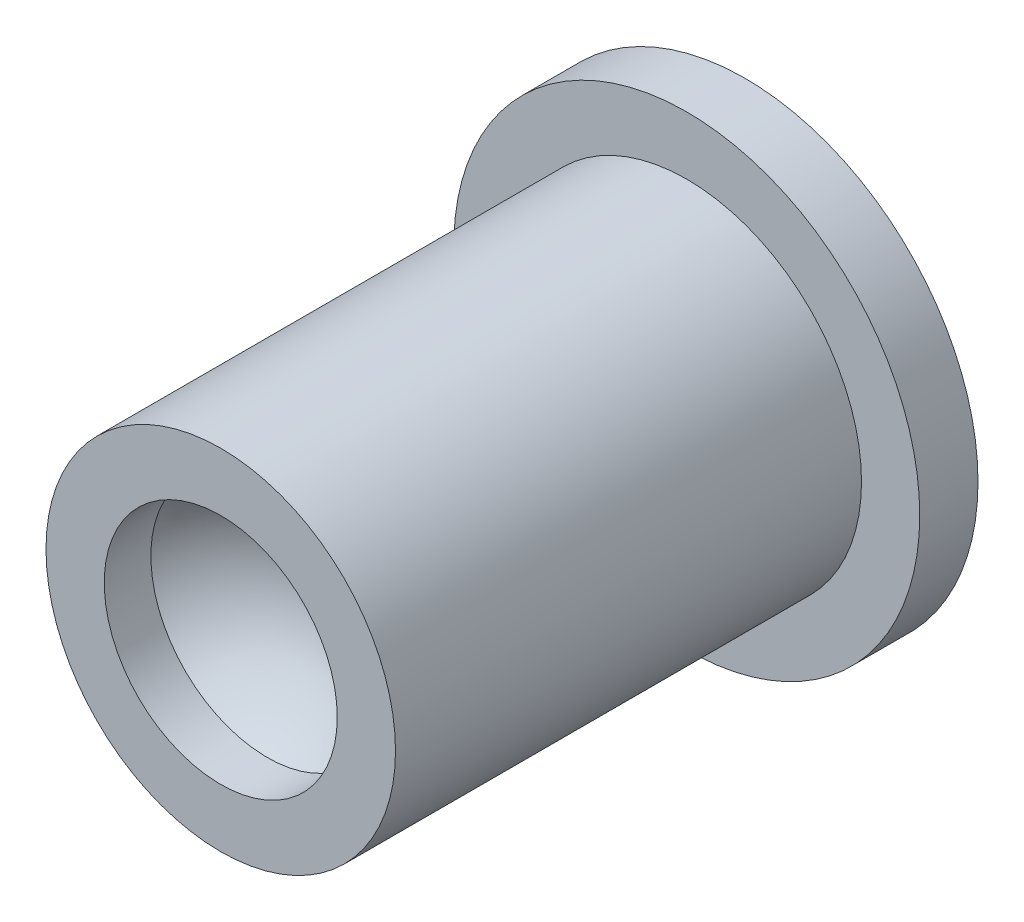
ISO-10303-21;
HEADER;
FILE_DESCRIPTION(('STEP AP214'),'2;1');
FILE_NAME('part.step','',(''),(''),'','','');
FILE_SCHEMA(('AUTOMOTIVE_DESIGN { 1 0 10303 214 1 1 1 1 }'));
ENDSEC;
DATA;
#1=APPLICATION_CONTEXT('core data for automotive mechanical design processes');
#2=APPLICATION_PROTOCOL_DEFINITION('international standard','automotive_design',2000,#1);
#3=PRODUCT_CONTEXT('',#1,'mechanical');
#4=PRODUCT('Part','Part','',(#3));
#5=PRODUCT_RELATED_PRODUCT_CATEGORY('part','',(#4));
#6=PRODUCT_DEFINITION_FORMATION('','',#4);
#7=PRODUCT_DEFINITION_CONTEXT('part definition',#1,'design');
#8=PRODUCT_DEFINITION('design','',#6,#7);
#9=PRODUCT_DEFINITION_SHAPE('','',#8);
#10=(LENGTH_UNIT() NAMED_UNIT(*) SI_UNIT(.MILLI.,.METRE.));
#11=(NAMED_UNIT(*) PLANE_ANGLE_UNIT() SI_UNIT($,.RADIAN.));
#12=(NAMED_UNIT(*) SI_UNIT($,.STERADIAN.) SOLID_ANGLE_UNIT());
#13=UNCERTAINTY_MEASURE_WITH_UNIT(LENGTH_MEASURE(1.E-05),#10,'distance_accuracy_value','');
#14=(GEOMETRIC_REPRESENTATION_CONTEXT(3) GLOBAL_UNCERTAINTY_ASSIGNED_CONTEXT((#13)) GLOBAL_UNIT_ASSIGNED_CONTEXT((#10,
#11,#12)) REPRESENTATION_CONTEXT('',''));
#15=CARTESIAN_POINT('',(0.,0.,0.));
#16=DIRECTION('',(0.,0.,1.));
#17=DIRECTION('',(1.,0.,0.));
#18=AXIS2_PLACEMENT_3D('',#15,#16,#17);
#19=CARTESIAN_POINT('',(0.,0.,1.));
#20=DIRECTION('',(0.,0.,1.));
#21=DIRECTION('',(1.,0.,0.));
#22=AXIS2_PLACEMENT_3D('',#19,#20,#21);
#23=PLANE('',#22);
#24=CARTESIAN_POINT('',(0.,0.,1.));
#25=DIRECTION('',(0.,0.,1.));
#26=DIRECTION('',(1.,0.,0.));
#27=AXIS2_PLACEMENT_3D('',#24,#25,#26);
#28=CIRCLE('',#27,4.);
#29=CARTESIAN_POINT('',(4.,0.,1.));
#30=VERTEX_POINT('',#29);
#31=EDGE_CURVE('E10',#30,#30,#28,.T.);
#32=ORIENTED_EDGE('',*,*,#31,.T.);
#33=EDGE_LOOP('',(#32));
#34=FACE_BOUND('',#33,.T.);
#35=CARTESIAN_POINT('',(0.,0.,1.));
#36=DIRECTION('',(0.,0.,1.));
#37=DIRECTION('',(1.,0.,0.));
#38=AXIS2_PLACEMENT_3D('',#35,#36,#37);
#39=CIRCLE('',#38,3.);
#40=CARTESIAN_POINT('',(3.,0.,1.));
#41=VERTEX_POINT('',#40);
#42=EDGE_CURVE('E43',#41,#41,#39,.T.);
#43=ORIENTED_EDGE('',*,*,#42,.F.);
#44=EDGE_LOOP('',(#43));
#45=FACE_BOUND('',#44,.T.);
#46=ADVANCED_FACE('F28',(#34,#45),#23,.T.);
#47=CARTESIAN_POINT('',(0.,0.,1.));
#48=DIRECTION('',(0.,0.,-1.));
#49=DIRECTION('',(-1.,0.,0.));
#50=AXIS2_PLACEMENT_3D('',#47,#48,#49);
#51=CYLINDRICAL_SURFACE('',#50,4.);
#52=ORIENTED_EDGE('',*,*,#31,.F.);
#53=EDGE_LOOP('',(#52));
#54=FACE_BOUND('',#53,.T.);
#55=CARTESIAN_POINT('',(0.,0.,0.));
#56=DIRECTION('',(0.,0.,1.));
#57=DIRECTION('',(1.,0.,0.));
#58=AXIS2_PLACEMENT_3D('',#55,#56,#57);
#59=CIRCLE('',#58,4.);
#60=CARTESIAN_POINT('',(4.,0.,0.));
#61=VERTEX_POINT('',#60);
#62=EDGE_CURVE('E36',#61,#61,#59,.T.);
#63=ORIENTED_EDGE('',*,*,#62,.T.);
#64=EDGE_LOOP('',(#63));
#65=FACE_BOUND('',#64,.T.);
#66=ADVANCED_FACE('F68',(#54,#65),#51,.T.);
#67=CARTESIAN_POINT('',(0.,0.,0.));
#68=DIRECTION('',(0.,0.,1.));
#69=DIRECTION('',(1.,0.,0.));
#70=AXIS2_PLACEMENT_3D('',#67,#68,#69);
#71=PLANE('',#70);
#72=ORIENTED_EDGE('',*,*,#62,.F.);
#73=EDGE_LOOP('',(#72));
#74=FACE_BOUND('',#73,.T.);
#75=ADVANCED_FACE('F73',(#74),#71,.F.);
#76=CARTESIAN_POINT('',(0.,0.,9.));
#77=DIRECTION('',(0.,0.,-1.));
#78=DIRECTION('',(-1.,0.,0.));
#79=AXIS2_PLACEMENT_3D('',#76,#77,#78);
#80=CYLINDRICAL_SURFACE('',#79,3.);
#81=CARTESIAN_POINT('',(0.,0.,9.));
#82=DIRECTION('',(0.,0.,1.));
#83=DIRECTION('',(1.,0.,0.));
#84=AXIS2_PLACEMENT_3D('',#81,#82,#83);
#85=CIRCLE('',#84,3.);
#86=CARTESIAN_POINT('',(3.,0.,9.));
#87=VERTEX_POINT('',#86);
#88=EDGE_CURVE('E41',#87,#87,#85,.T.);
#89=ORIENTED_EDGE('',*,*,#88,.F.);
#90=EDGE_LOOP('',(#89));
#91=FACE_BOUND('',#90,.T.);
#92=ORIENTED_EDGE('',*,*,#42,.T.);
#93=EDGE_LOOP('',(#92));
#94=FACE_BOUND('',#93,.T.);
#95=ADVANCED_FACE('F64',(#91,#94),#80,.T.);
#96=CARTESIAN_POINT('',(0.,0.,9.));
#97=DIRECTION('',(0.,0.,1.));
#98=DIRECTION('',(1.,0.,0.));
#99=AXIS2_PLACEMENT_3D('',#96,#97,#98);
#100=PLANE('',#99);
#101=CARTESIAN_POINT('',(0.,0.,9.));
#102=DIRECTION('',(0.,0.,1.));
#103=DIRECTION('',(1.,0.,0.));
#104=AXIS2_PLACEMENT_3D('',#101,#102,#103);
#105=CIRCLE('',#104,2.);
#106=CARTESIAN_POINT('',(2.,0.,9.));
#107=VERTEX_POINT('',#106);
#108=EDGE_CURVE('E48',#107,#107,#105,.T.);
#109=ORIENTED_EDGE('',*,*,#108,.F.);
#110=EDGE_LOOP('',(#109));
#111=FACE_BOUND('',#110,.T.);
#112=ORIENTED_EDGE('',*,*,#88,.T.);
#113=EDGE_LOOP('',(#112));
#114=FACE_BOUND('',#113,.T.);
#115=ADVANCED_FACE('F58',(#111,#114),#100,.T.);
#116=CARTESIAN_POINT('',(0.,0.,8.2));
#117=DIRECTION('',(0.,0.,1.));
#118=DIRECTION('',(1.,0.,0.));
#119=AXIS2_PLACEMENT_3D('',#116,#117,#118);
#120=CYLINDRICAL_SURFACE('',#119,2.);
#121=CARTESIAN_POINT('',(0.,0.,8.2));
#122=DIRECTION('',(0.,0.,1.));
#123=DIRECTION('',(1.,0.,0.));
#124=AXIS2_PLACEMENT_3D('',#121,#122,#123);
#125=CIRCLE('',#124,2.);
#126=CARTESIAN_POINT('',(2.,0.,8.2));
#127=VERTEX_POINT('',#126);
#128=EDGE_CURVE('E32',#127,#127,#125,.T.);
#129=ORIENTED_EDGE('',*,*,#128,.F.);
#130=EDGE_LOOP('',(#129));
#131=FACE_BOUND('',#130,.T.);
#132=ORIENTED_EDGE('',*,*,#108,.T.);
#133=EDGE_LOOP('',(#132));
#134=FACE_BOUND('',#133,.T.);
#135=ADVANCED_FACE('F56',(#131,#134),#120,.F.);
#136=CARTESIAN_POINT('',(0.,0.,9.7));
#137=DIRECTION('',(0.,0.,1.));
#138=DIRECTION('',(1.,0.,0.));
#139=AXIS2_PLACEMENT_3D('',#136,#137,#138);
#140=SPHERICAL_SURFACE('',#139,2.5);
#141=ORIENTED_EDGE('',*,*,#128,.T.);
#142=EDGE_LOOP('',(#141));
#143=FACE_BOUND('',#142,.T.);
#144=ADVANCED_FACE('F30',(#143),#140,.F.);
#145=CLOSED_SHELL('',(#46,#66,#75,#95,#115,#135,#144));
#146=MANIFOLD_SOLID_BREP('B2',#145);
#147=ADVANCED_BREP_SHAPE_REPRESENTATION('',(#18,#146),#14);
#148=SHAPE_DEFINITION_REPRESENTATION(#9,#147);
ENDSEC;
END-ISO-10303-21;
